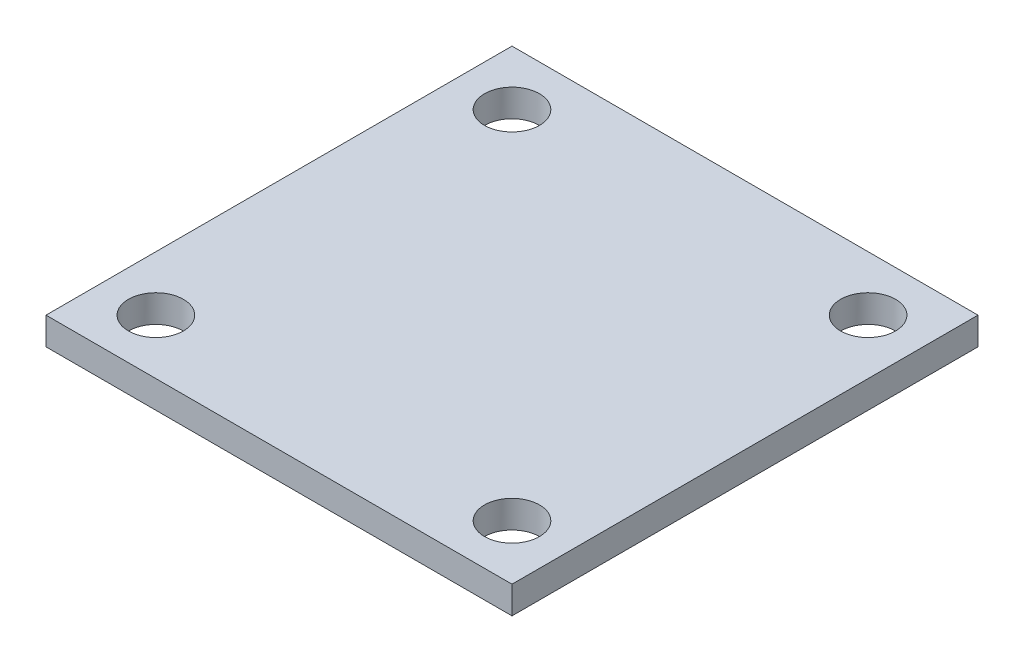
ISO-10303-21;
HEADER;
FILE_DESCRIPTION(('STEP AP214'),'2;1');
FILE_NAME('part.step','',(''),(''),'','','');
FILE_SCHEMA(('AUTOMOTIVE_DESIGN { 1 0 10303 214 1 1 1 1 }'));
ENDSEC;
DATA;
#1=APPLICATION_CONTEXT('core data for automotive mechanical design processes');
#2=APPLICATION_PROTOCOL_DEFINITION('international standard','automotive_design',2000,#1);
#3=PRODUCT_CONTEXT('',#1,'mechanical');
#4=PRODUCT('Part','Part','',(#3));
#5=PRODUCT_RELATED_PRODUCT_CATEGORY('part','',(#4));
#6=PRODUCT_DEFINITION_FORMATION('','',#4);
#7=PRODUCT_DEFINITION_CONTEXT('part definition',#1,'design');
#8=PRODUCT_DEFINITION('design','',#6,#7);
#9=PRODUCT_DEFINITION_SHAPE('','',#8);
#10=(LENGTH_UNIT() NAMED_UNIT(*) SI_UNIT(.MILLI.,.METRE.));
#11=(NAMED_UNIT(*) PLANE_ANGLE_UNIT() SI_UNIT($,.RADIAN.));
#12=(NAMED_UNIT(*) SI_UNIT($,.STERADIAN.) SOLID_ANGLE_UNIT());
#13=UNCERTAINTY_MEASURE_WITH_UNIT(LENGTH_MEASURE(1.E-05),#10,'distance_accuracy_value','');
#14=(GEOMETRIC_REPRESENTATION_CONTEXT(3) GLOBAL_UNCERTAINTY_ASSIGNED_CONTEXT((#13)) GLOBAL_UNIT_ASSIGNED_CONTEXT((#10,
#11,#12)) REPRESENTATION_CONTEXT('',''));
#15=CARTESIAN_POINT('',(0.,0.,0.));
#16=DIRECTION('',(0.,0.,1.));
#17=DIRECTION('',(1.,0.,0.));
#18=AXIS2_PLACEMENT_3D('',#15,#16,#17);
#19=CARTESIAN_POINT('',(0.,1.5875,0.));
#20=DIRECTION('',(0.,-1.,0.));
#21=DIRECTION('',(0.,0.,-1.));
#22=AXIS2_PLACEMENT_3D('',#19,#20,#21);
#23=PLANE('',#22);
#24=CARTESIAN_POINT('',(-10.287,1.58750000000001,-10.287));
#25=DIRECTION('',(0.,1.,0.));
#26=DIRECTION('',(0.,0.,1.));
#27=AXIS2_PLACEMENT_3D('',#24,#25,#26);
#28=CIRCLE('',#27,1.5875);
#29=CARTESIAN_POINT('',(-10.287,1.58750000000001,-8.69949999999999));
#30=VERTEX_POINT('',#29);
#31=EDGE_CURVE('E129',#30,#30,#28,.T.);
#32=ORIENTED_EDGE('',*,*,#31,.F.);
#33=EDGE_LOOP('',(#32));
#34=FACE_BOUND('',#33,.T.);
#35=CARTESIAN_POINT('',(10.287,1.58750000000001,-10.287));
#36=DIRECTION('',(0.,1.,0.));
#37=DIRECTION('',(0.,0.,1.));
#38=AXIS2_PLACEMENT_3D('',#35,#36,#37);
#39=CIRCLE('',#38,1.5875);
#40=CARTESIAN_POINT('',(10.287,1.58750000000001,-8.69949999999999));
#41=VERTEX_POINT('',#40);
#42=EDGE_CURVE('E114',#41,#41,#39,.F.);
#43=ORIENTED_EDGE('',*,*,#42,.T.);
#44=EDGE_LOOP('',(#43));
#45=FACE_BOUND('',#44,.T.);
#46=DIRECTION('',(0.,0.,-1.));
#47=VECTOR('',#46,1.);
#48=CARTESIAN_POINT('',(13.462,1.5875,13.462));
#49=LINE('',#48,#47);
#50=CARTESIAN_POINT('',(13.462,1.5875,13.462));
#51=VERTEX_POINT('',#50);
#52=CARTESIAN_POINT('',(13.462,1.5875,-13.462));
#53=VERTEX_POINT('',#52);
#54=EDGE_CURVE('E85',#51,#53,#49,.T.);
#55=ORIENTED_EDGE('',*,*,#54,.T.);
#56=DIRECTION('',(-1.,0.,0.));
#57=VECTOR('',#56,1.);
#58=CARTESIAN_POINT('',(-13.462,1.5875,-13.462));
#59=LINE('',#58,#57);
#60=CARTESIAN_POINT('',(-13.462,1.5875,-13.462));
#61=VERTEX_POINT('',#60);
#62=EDGE_CURVE('E80',#53,#61,#59,.T.);
#63=ORIENTED_EDGE('',*,*,#62,.T.);
#64=DIRECTION('',(0.,0.,1.));
#65=VECTOR('',#64,1.);
#66=CARTESIAN_POINT('',(-13.462,1.5875,13.462));
#67=LINE('',#66,#65);
#68=CARTESIAN_POINT('',(-13.462,1.5875,13.462));
#69=VERTEX_POINT('',#68);
#70=EDGE_CURVE('E83',#61,#69,#67,.T.);
#71=ORIENTED_EDGE('',*,*,#70,.T.);
#72=DIRECTION('',(1.,0.,0.));
#73=VECTOR('',#72,1.);
#74=CARTESIAN_POINT('',(-13.462,1.5875,13.462));
#75=LINE('',#74,#73);
#76=EDGE_CURVE('E50',#69,#51,#75,.T.);
#77=ORIENTED_EDGE('',*,*,#76,.T.);
#78=EDGE_LOOP('',(#55,#63,#71,#77));
#79=FACE_BOUND('',#78,.T.);
#80=CARTESIAN_POINT('',(10.287,1.58750000000001,10.287));
#81=DIRECTION('',(0.,1.,0.));
#82=DIRECTION('',(0.,0.,1.));
#83=AXIS2_PLACEMENT_3D('',#80,#81,#82);
#84=CIRCLE('',#83,1.5875);
#85=CARTESIAN_POINT('',(10.287,1.58750000000001,11.8745));
#86=VERTEX_POINT('',#85);
#87=EDGE_CURVE('E117',#86,#86,#84,.T.);
#88=ORIENTED_EDGE('',*,*,#87,.F.);
#89=EDGE_LOOP('',(#88));
#90=FACE_BOUND('',#89,.T.);
#91=CARTESIAN_POINT('',(-10.287,1.58750000000001,10.287));
#92=DIRECTION('',(0.,1.,0.));
#93=DIRECTION('',(0.,0.,1.));
#94=AXIS2_PLACEMENT_3D('',#91,#92,#93);
#95=CIRCLE('',#94,1.5875);
#96=CARTESIAN_POINT('',(-10.287,1.58750000000001,11.8745));
#97=VERTEX_POINT('',#96);
#98=EDGE_CURVE('E126',#97,#97,#95,.F.);
#99=ORIENTED_EDGE('',*,*,#98,.T.);
#100=EDGE_LOOP('',(#99));
#101=FACE_BOUND('',#100,.T.);
#102=ADVANCED_FACE('F33',(#34,#45,#79,#90,#101),#23,.F.);
#103=CARTESIAN_POINT('',(0.,0.,0.));
#104=DIRECTION('',(0.,-1.,0.));
#105=DIRECTION('',(0.,0.,-1.));
#106=AXIS2_PLACEMENT_3D('',#103,#104,#105);
#107=PLANE('',#106);
#108=CARTESIAN_POINT('',(-10.287,0.,-10.287));
#109=DIRECTION('',(0.,-1.,0.));
#110=DIRECTION('',(0.,0.,-1.));
#111=AXIS2_PLACEMENT_3D('',#108,#109,#110);
#112=CIRCLE('',#111,1.5875);
#113=CARTESIAN_POINT('',(-10.287,0.,-11.8745));
#114=VERTEX_POINT('',#113);
#115=EDGE_CURVE('E130',#114,#114,#112,.F.);
#116=ORIENTED_EDGE('',*,*,#115,.T.);
#117=EDGE_LOOP('',(#116));
#118=FACE_BOUND('',#117,.T.);
#119=CARTESIAN_POINT('',(10.287,0.,-10.287));
#120=DIRECTION('',(0.,-1.,0.));
#121=DIRECTION('',(0.,0.,-1.));
#122=AXIS2_PLACEMENT_3D('',#119,#120,#121);
#123=CIRCLE('',#122,1.5875);
#124=CARTESIAN_POINT('',(10.287,0.,-11.8745));
#125=VERTEX_POINT('',#124);
#126=EDGE_CURVE('E100',#125,#125,#123,.T.);
#127=ORIENTED_EDGE('',*,*,#126,.F.);
#128=EDGE_LOOP('',(#127));
#129=FACE_BOUND('',#128,.T.);
#130=DIRECTION('',(0.,0.,-1.));
#131=VECTOR('',#130,1.);
#132=CARTESIAN_POINT('',(13.462,0.,13.462));
#133=LINE('',#132,#131);
#134=CARTESIAN_POINT('',(13.462,0.,13.462));
#135=VERTEX_POINT('',#134);
#136=CARTESIAN_POINT('',(13.462,0.,-13.462));
#137=VERTEX_POINT('',#136);
#138=EDGE_CURVE('E97',#135,#137,#133,.T.);
#139=ORIENTED_EDGE('',*,*,#138,.F.);
#140=DIRECTION('',(1.,0.,0.));
#141=VECTOR('',#140,1.);
#142=CARTESIAN_POINT('',(-13.462,0.,13.462));
#143=LINE('',#142,#141);
#144=CARTESIAN_POINT('',(-13.462,0.,13.462));
#145=VERTEX_POINT('',#144);
#146=EDGE_CURVE('E73',#145,#135,#143,.T.);
#147=ORIENTED_EDGE('',*,*,#146,.F.);
#148=DIRECTION('',(0.,0.,1.));
#149=VECTOR('',#148,1.);
#150=CARTESIAN_POINT('',(-13.462,0.,13.462));
#151=LINE('',#150,#149);
#152=CARTESIAN_POINT('',(-13.462,0.,-13.462));
#153=VERTEX_POINT('',#152);
#154=EDGE_CURVE('E67',#153,#145,#151,.T.);
#155=ORIENTED_EDGE('',*,*,#154,.F.);
#156=DIRECTION('',(-1.,0.,0.));
#157=VECTOR('',#156,1.);
#158=CARTESIAN_POINT('',(-13.462,0.,-13.462));
#159=LINE('',#158,#157);
#160=EDGE_CURVE('E89',#137,#153,#159,.T.);
#161=ORIENTED_EDGE('',*,*,#160,.F.);
#162=EDGE_LOOP('',(#139,#147,#155,#161));
#163=FACE_BOUND('',#162,.T.);
#164=CARTESIAN_POINT('',(10.287,0.,10.287));
#165=DIRECTION('',(0.,-1.,0.));
#166=DIRECTION('',(0.,0.,-1.));
#167=AXIS2_PLACEMENT_3D('',#164,#165,#166);
#168=CIRCLE('',#167,1.5875);
#169=CARTESIAN_POINT('',(10.287,0.,8.69949999999999));
#170=VERTEX_POINT('',#169);
#171=EDGE_CURVE('E118',#170,#170,#168,.F.);
#172=ORIENTED_EDGE('',*,*,#171,.T.);
#173=EDGE_LOOP('',(#172));
#174=FACE_BOUND('',#173,.T.);
#175=CARTESIAN_POINT('',(-10.287,0.,10.287));
#176=DIRECTION('',(0.,-1.,0.));
#177=DIRECTION('',(0.,0.,-1.));
#178=AXIS2_PLACEMENT_3D('',#175,#176,#177);
#179=CIRCLE('',#178,1.5875);
#180=CARTESIAN_POINT('',(-10.287,0.,8.69949999999999));
#181=VERTEX_POINT('',#180);
#182=EDGE_CURVE('E121',#181,#181,#179,.T.);
#183=ORIENTED_EDGE('',*,*,#182,.F.);
#184=EDGE_LOOP('',(#183));
#185=FACE_BOUND('',#184,.T.);
#186=ADVANCED_FACE('F108',(#118,#129,#163,#174,#185),#107,.T.);
#187=CARTESIAN_POINT('',(13.462,1.5875,13.462));
#188=DIRECTION('',(-1.,0.,0.));
#189=DIRECTION('',(0.,0.,1.));
#190=AXIS2_PLACEMENT_3D('',#187,#188,#189);
#191=PLANE('',#190);
#192=ORIENTED_EDGE('',*,*,#138,.T.);
#193=DIRECTION('',(0.,-1.,0.));
#194=VECTOR('',#193,1.);
#195=CARTESIAN_POINT('',(13.462,1.5875,-13.462));
#196=LINE('',#195,#194);
#197=EDGE_CURVE('E11',#53,#137,#196,.T.);
#198=ORIENTED_EDGE('',*,*,#197,.F.);
#199=ORIENTED_EDGE('',*,*,#54,.F.);
#200=DIRECTION('',(0.,-1.,0.));
#201=VECTOR('',#200,1.);
#202=CARTESIAN_POINT('',(13.462,1.5875,13.462));
#203=LINE('',#202,#201);
#204=EDGE_CURVE('E93',#51,#135,#203,.T.);
#205=ORIENTED_EDGE('',*,*,#204,.T.);
#206=EDGE_LOOP('',(#192,#198,#199,#205));
#207=FACE_BOUND('',#206,.T.);
#208=ADVANCED_FACE('F35',(#207),#191,.F.);
#209=CARTESIAN_POINT('',(-13.462,1.5875,-13.462));
#210=DIRECTION('',(0.,0.,1.));
#211=DIRECTION('',(1.,0.,0.));
#212=AXIS2_PLACEMENT_3D('',#209,#210,#211);
#213=PLANE('',#212);
#214=ORIENTED_EDGE('',*,*,#160,.T.);
#215=DIRECTION('',(0.,-1.,0.));
#216=VECTOR('',#215,1.);
#217=CARTESIAN_POINT('',(-13.462,1.5875,-13.462));
#218=LINE('',#217,#216);
#219=EDGE_CURVE('E42',#61,#153,#218,.T.);
#220=ORIENTED_EDGE('',*,*,#219,.F.);
#221=ORIENTED_EDGE('',*,*,#62,.F.);
#222=ORIENTED_EDGE('',*,*,#197,.T.);
#223=EDGE_LOOP('',(#214,#220,#221,#222));
#224=FACE_BOUND('',#223,.T.);
#225=ADVANCED_FACE('F88',(#224),#213,.F.);
#226=CARTESIAN_POINT('',(-13.462,1.5875,13.462));
#227=DIRECTION('',(1.,0.,0.));
#228=DIRECTION('',(0.,0.,-1.));
#229=AXIS2_PLACEMENT_3D('',#226,#227,#228);
#230=PLANE('',#229);
#231=ORIENTED_EDGE('',*,*,#154,.T.);
#232=DIRECTION('',(0.,-1.,0.));
#233=VECTOR('',#232,1.);
#234=CARTESIAN_POINT('',(-13.462,1.5875,13.462));
#235=LINE('',#234,#233);
#236=EDGE_CURVE('E90',#69,#145,#235,.T.);
#237=ORIENTED_EDGE('',*,*,#236,.F.);
#238=ORIENTED_EDGE('',*,*,#70,.F.);
#239=ORIENTED_EDGE('',*,*,#219,.T.);
#240=EDGE_LOOP('',(#231,#237,#238,#239));
#241=FACE_BOUND('',#240,.T.);
#242=ADVANCED_FACE('F91',(#241),#230,.F.);
#243=CARTESIAN_POINT('',(-13.462,1.5875,13.462));
#244=DIRECTION('',(0.,0.,-1.));
#245=DIRECTION('',(-1.,0.,0.));
#246=AXIS2_PLACEMENT_3D('',#243,#244,#245);
#247=PLANE('',#246);
#248=ORIENTED_EDGE('',*,*,#146,.T.);
#249=ORIENTED_EDGE('',*,*,#204,.F.);
#250=ORIENTED_EDGE('',*,*,#76,.F.);
#251=ORIENTED_EDGE('',*,*,#236,.T.);
#252=EDGE_LOOP('',(#248,#249,#250,#251));
#253=FACE_BOUND('',#252,.T.);
#254=ADVANCED_FACE('F105',(#253),#247,.F.);
#255=CARTESIAN_POINT('',(10.287,-0.000999999999999916,-10.287));
#256=DIRECTION('',(0.,1.,0.));
#257=DIRECTION('',(0.,0.,1.));
#258=AXIS2_PLACEMENT_3D('',#255,#256,#257);
#259=CYLINDRICAL_SURFACE('',#258,1.5875);
#260=ORIENTED_EDGE('',*,*,#126,.T.);
#261=EDGE_LOOP('',(#260));
#262=FACE_BOUND('',#261,.T.);
#263=ORIENTED_EDGE('',*,*,#42,.F.);
#264=EDGE_LOOP('',(#263));
#265=FACE_BOUND('',#264,.T.);
#266=ADVANCED_FACE('F143',(#262,#265),#259,.F.);
#267=CARTESIAN_POINT('',(10.287,-0.000999999999999916,10.287));
#268=DIRECTION('',(0.,1.,0.));
#269=DIRECTION('',(0.,0.,1.));
#270=AXIS2_PLACEMENT_3D('',#267,#268,#269);
#271=CYLINDRICAL_SURFACE('',#270,1.5875);
#272=ORIENTED_EDGE('',*,*,#171,.F.);
#273=EDGE_LOOP('',(#272));
#274=FACE_BOUND('',#273,.T.);
#275=ORIENTED_EDGE('',*,*,#87,.T.);
#276=EDGE_LOOP('',(#275));
#277=FACE_BOUND('',#276,.T.);
#278=ADVANCED_FACE('F145',(#274,#277),#271,.F.);
#279=CARTESIAN_POINT('',(-10.287,-0.000999999999999916,10.287));
#280=DIRECTION('',(0.,1.,0.));
#281=DIRECTION('',(0.,0.,1.));
#282=AXIS2_PLACEMENT_3D('',#279,#280,#281);
#283=CYLINDRICAL_SURFACE('',#282,1.5875);
#284=ORIENTED_EDGE('',*,*,#182,.T.);
#285=EDGE_LOOP('',(#284));
#286=FACE_BOUND('',#285,.T.);
#287=ORIENTED_EDGE('',*,*,#98,.F.);
#288=EDGE_LOOP('',(#287));
#289=FACE_BOUND('',#288,.T.);
#290=ADVANCED_FACE('F152',(#286,#289),#283,.F.);
#291=CARTESIAN_POINT('',(-10.287,-0.000999999999999916,-10.287));
#292=DIRECTION('',(0.,1.,0.));
#293=DIRECTION('',(0.,0.,1.));
#294=AXIS2_PLACEMENT_3D('',#291,#292,#293);
#295=CYLINDRICAL_SURFACE('',#294,1.5875);
#296=ORIENTED_EDGE('',*,*,#115,.F.);
#297=EDGE_LOOP('',(#296));
#298=FACE_BOUND('',#297,.T.);
#299=ORIENTED_EDGE('',*,*,#31,.T.);
#300=EDGE_LOOP('',(#299));
#301=FACE_BOUND('',#300,.T.);
#302=ADVANCED_FACE('F136',(#298,#301),#295,.F.);
#303=CLOSED_SHELL('',(#102,#186,#208,#225,#242,#254,#266,#278,#290,#302));
#304=MANIFOLD_SOLID_BREP('B2',#303);
#305=ADVANCED_BREP_SHAPE_REPRESENTATION('',(#18,#304),#14);
#306=SHAPE_DEFINITION_REPRESENTATION(#9,#305);
ENDSEC;
END-ISO-10303-21;
